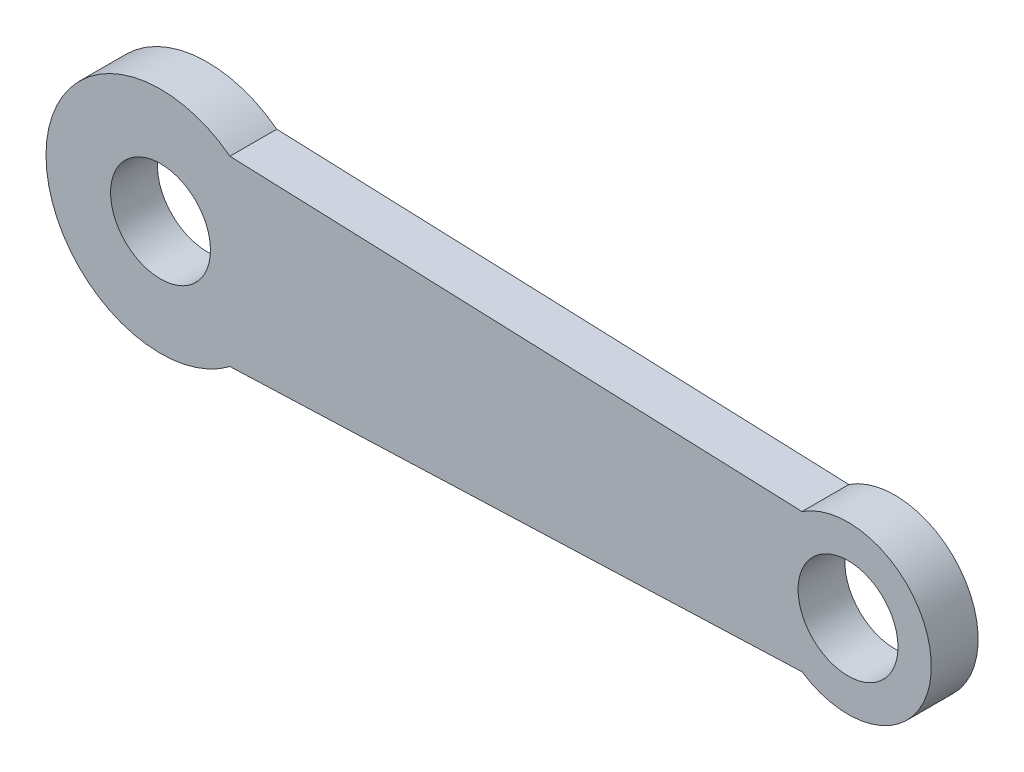
ISO-10303-21;
HEADER;
FILE_DESCRIPTION(('STEP AP214'),'2;1');
FILE_NAME('part.step','',(''),(''),'','','');
FILE_SCHEMA(('AUTOMOTIVE_DESIGN { 1 0 10303 214 1 1 1 1 }'));
ENDSEC;
DATA;
#1=APPLICATION_CONTEXT('core data for automotive mechanical design processes');
#2=APPLICATION_PROTOCOL_DEFINITION('international standard','automotive_design',2000,#1);
#3=PRODUCT_CONTEXT('',#1,'mechanical');
#4=PRODUCT('Part','Part','',(#3));
#5=PRODUCT_RELATED_PRODUCT_CATEGORY('part','',(#4));
#6=PRODUCT_DEFINITION_FORMATION('','',#4);
#7=PRODUCT_DEFINITION_CONTEXT('part definition',#1,'design');
#8=PRODUCT_DEFINITION('design','',#6,#7);
#9=PRODUCT_DEFINITION_SHAPE('','',#8);
#10=(LENGTH_UNIT() NAMED_UNIT(*) SI_UNIT(.MILLI.,.METRE.));
#11=(NAMED_UNIT(*) PLANE_ANGLE_UNIT() SI_UNIT($,.RADIAN.));
#12=(NAMED_UNIT(*) SI_UNIT($,.STERADIAN.) SOLID_ANGLE_UNIT());
#13=UNCERTAINTY_MEASURE_WITH_UNIT(LENGTH_MEASURE(1.E-05),#10,'distance_accuracy_value','');
#14=(GEOMETRIC_REPRESENTATION_CONTEXT(3) GLOBAL_UNCERTAINTY_ASSIGNED_CONTEXT((#13)) GLOBAL_UNIT_ASSIGNED_CONTEXT((#10,
#11,#12)) REPRESENTATION_CONTEXT('',''));
#15=CARTESIAN_POINT('',(0.,0.,0.));
#16=DIRECTION('',(0.,0.,1.));
#17=DIRECTION('',(1.,0.,0.));
#18=AXIS2_PLACEMENT_3D('',#15,#16,#17);
#19=CARTESIAN_POINT('',(0.,-9.,2.25));
#20=DIRECTION('',(-0.0378240593322877,0.999284414236321,0.));
#21=DIRECTION('',(-0.999284414236321,-0.0378240593322877,0.));
#22=AXIS2_PLACEMENT_3D('',#19,#20,#21);
#23=PLANE('',#22);
#24=DIRECTION('',(0.,0.,-1.));
#25=VECTOR('',#24,1.);
#26=CARTESIAN_POINT('',(61.6270569048173,-6.66734532868355,2.25));
#27=LINE('',#26,#25);
#28=CARTESIAN_POINT('',(61.6270569048173,-6.66734532868355,2.25));
#29=VERTEX_POINT('',#28);
#30=CARTESIAN_POINT('',(61.6270569048173,-6.66734532868355,-2.25));
#31=VERTEX_POINT('',#30);
#32=EDGE_CURVE('E58',#29,#31,#27,.T.);
#33=ORIENTED_EDGE('',*,*,#32,.F.);
#34=DIRECTION('',(0.999284414236321,0.0378240593322877,0.));
#35=VECTOR('',#34,1.);
#36=CARTESIAN_POINT('',(0.,-9.,2.25));
#37=LINE('',#36,#35);
#38=CARTESIAN_POINT('',(6.6693507070867,-8.74755743884441,2.25));
#39=VERTEX_POINT('',#38);
#40=EDGE_CURVE('E89',#39,#29,#37,.T.);
#41=ORIENTED_EDGE('',*,*,#40,.F.);
#42=DIRECTION('',(0.,0.,-1.));
#43=VECTOR('',#42,1.);
#44=CARTESIAN_POINT('',(6.6693507070867,-8.74755743884441,2.25));
#45=LINE('',#44,#43);
#46=CARTESIAN_POINT('',(6.6693507070867,-8.74755743884441,-2.25));
#47=VERTEX_POINT('',#46);
#48=EDGE_CURVE('E94',#39,#47,#45,.T.);
#49=ORIENTED_EDGE('',*,*,#48,.T.);
#50=DIRECTION('',(0.999284414236321,0.0378240593322877,0.));
#51=VECTOR('',#50,1.);
#52=CARTESIAN_POINT('',(0.,-9.,-2.25));
#53=LINE('',#52,#51);
#54=EDGE_CURVE('E57',#47,#31,#53,.T.);
#55=ORIENTED_EDGE('',*,*,#54,.T.);
#56=EDGE_LOOP('',(#33,#41,#49,#55));
#57=FACE_BOUND('',#56,.T.);
#58=ADVANCED_FACE('F39',(#57),#23,.F.);
#59=CARTESIAN_POINT('',(66.0482,6.5,2.25));
#60=DIRECTION('',(-0.0378240593322877,-0.999284414236321,0.));
#61=DIRECTION('',(0.999284414236321,-0.0378240593322877,0.));
#62=AXIS2_PLACEMENT_3D('',#59,#60,#61);
#63=PLANE('',#62);
#64=DIRECTION('',(0.,0.,-1.));
#65=VECTOR('',#64,1.);
#66=CARTESIAN_POINT('',(61.6270569048173,6.66734532868355,2.25));
#67=LINE('',#66,#65);
#68=CARTESIAN_POINT('',(61.6270569048173,6.66734532868355,-2.25));
#69=VERTEX_POINT('',#68);
#70=CARTESIAN_POINT('',(61.6270569048173,6.66734532868355,2.25));
#71=VERTEX_POINT('',#70);
#72=EDGE_CURVE('E11',#69,#71,#67,.F.);
#73=ORIENTED_EDGE('',*,*,#72,.F.);
#74=DIRECTION('',(-0.999284414236321,0.0378240593322877,0.));
#75=VECTOR('',#74,1.);
#76=CARTESIAN_POINT('',(66.0482,6.5,-2.25));
#77=LINE('',#76,#75);
#78=CARTESIAN_POINT('',(6.6693507070867,8.74755743884441,-2.25));
#79=VERTEX_POINT('',#78);
#80=EDGE_CURVE('E99',#69,#79,#77,.T.);
#81=ORIENTED_EDGE('',*,*,#80,.T.);
#82=DIRECTION('',(0.,0.,-1.));
#83=VECTOR('',#82,1.);
#84=CARTESIAN_POINT('',(6.6693507070867,8.74755743884441,2.25));
#85=LINE('',#84,#83);
#86=CARTESIAN_POINT('',(6.66935070708669,8.74755743884441,2.25));
#87=VERTEX_POINT('',#86);
#88=EDGE_CURVE('E87',#79,#87,#85,.F.);
#89=ORIENTED_EDGE('',*,*,#88,.T.);
#90=DIRECTION('',(-0.999284414236321,0.0378240593322877,0.));
#91=VECTOR('',#90,1.);
#92=CARTESIAN_POINT('',(66.0482,6.5,2.25));
#93=LINE('',#92,#91);
#94=EDGE_CURVE('E85',#71,#87,#93,.T.);
#95=ORIENTED_EDGE('',*,*,#94,.F.);
#96=EDGE_LOOP('',(#73,#81,#89,#95));
#97=FACE_BOUND('',#96,.T.);
#98=ADVANCED_FACE('F96',(#97),#63,.F.);
#99=CARTESIAN_POINT('',(0.,0.,2.25));
#100=DIRECTION('',(0.,0.,-1.));
#101=DIRECTION('',(-1.,0.,0.));
#102=AXIS2_PLACEMENT_3D('',#99,#100,#101);
#103=CYLINDRICAL_SURFACE('',#102,11.);
#104=ORIENTED_EDGE('',*,*,#48,.F.);
#105=CARTESIAN_POINT('',(0.,0.,2.25));
#106=DIRECTION('',(0.,0.,1.));
#107=DIRECTION('',(1.,0.,0.));
#108=AXIS2_PLACEMENT_3D('',#105,#106,#107);
#109=CIRCLE('',#108,11.);
#110=EDGE_CURVE('E48',#87,#39,#109,.T.);
#111=ORIENTED_EDGE('',*,*,#110,.F.);
#112=ORIENTED_EDGE('',*,*,#88,.F.);
#113=CARTESIAN_POINT('',(0.,0.,-2.25));
#114=DIRECTION('',(0.,0.,1.));
#115=DIRECTION('',(1.,0.,0.));
#116=AXIS2_PLACEMENT_3D('',#113,#114,#115);
#117=CIRCLE('',#116,11.);
#118=EDGE_CURVE('E98',#79,#47,#117,.T.);
#119=ORIENTED_EDGE('',*,*,#118,.T.);
#120=EDGE_LOOP('',(#104,#111,#112,#119));
#121=FACE_BOUND('',#120,.T.);
#122=ADVANCED_FACE('F41',(#121),#103,.T.);
#123=CARTESIAN_POINT('',(0.,0.,2.25));
#124=DIRECTION('',(0.,0.,1.));
#125=DIRECTION('',(1.,0.,0.));
#126=AXIS2_PLACEMENT_3D('',#123,#124,#125);
#127=PLANE('',#126);
#128=CARTESIAN_POINT('',(0.,0.,2.25));
#129=DIRECTION('',(0.,0.,1.));
#130=DIRECTION('',(1.,0.,0.));
#131=AXIS2_PLACEMENT_3D('',#128,#129,#130);
#132=CIRCLE('',#131,4.8);
#133=CARTESIAN_POINT('',(4.8,0.,2.25));
#134=VERTEX_POINT('',#133);
#135=EDGE_CURVE('E116',#134,#134,#132,.T.);
#136=ORIENTED_EDGE('',*,*,#135,.F.);
#137=EDGE_LOOP('',(#136));
#138=FACE_BOUND('',#137,.T.);
#139=CARTESIAN_POINT('',(66.0482,0.,2.25));
#140=DIRECTION('',(0.,0.,1.));
#141=DIRECTION('',(1.,0.,0.));
#142=AXIS2_PLACEMENT_3D('',#139,#140,#141);
#143=CIRCLE('',#142,4.8);
#144=CARTESIAN_POINT('',(70.8482,0.,2.25));
#145=VERTEX_POINT('',#144);
#146=EDGE_CURVE('E108',#145,#145,#143,.T.);
#147=ORIENTED_EDGE('',*,*,#146,.F.);
#148=EDGE_LOOP('',(#147));
#149=FACE_BOUND('',#148,.T.);
#150=CARTESIAN_POINT('',(66.0482,0.,2.25));
#151=DIRECTION('',(0.,0.,1.));
#152=DIRECTION('',(1.,0.,0.));
#153=AXIS2_PLACEMENT_3D('',#150,#151,#152);
#154=CIRCLE('',#153,7.99999999999999);
#155=EDGE_CURVE('E86',#29,#71,#154,.T.);
#156=ORIENTED_EDGE('',*,*,#155,.T.);
#157=ORIENTED_EDGE('',*,*,#94,.T.);
#158=ORIENTED_EDGE('',*,*,#110,.T.);
#159=ORIENTED_EDGE('',*,*,#40,.T.);
#160=EDGE_LOOP('',(#156,#157,#158,#159));
#161=FACE_BOUND('',#160,.T.);
#162=ADVANCED_FACE('F81',(#138,#149,#161),#127,.T.);
#163=CARTESIAN_POINT('',(0.,0.,-2.25));
#164=DIRECTION('',(0.,0.,1.));
#165=DIRECTION('',(1.,0.,0.));
#166=AXIS2_PLACEMENT_3D('',#163,#164,#165);
#167=PLANE('',#166);
#168=CARTESIAN_POINT('',(0.,0.,-2.25));
#169=DIRECTION('',(0.,0.,1.));
#170=DIRECTION('',(1.,0.,0.));
#171=AXIS2_PLACEMENT_3D('',#168,#169,#170);
#172=CIRCLE('',#171,4.8);
#173=CARTESIAN_POINT('',(4.8,0.,-2.25));
#174=VERTEX_POINT('',#173);
#175=EDGE_CURVE('E43',#174,#174,#172,.T.);
#176=ORIENTED_EDGE('',*,*,#175,.T.);
#177=EDGE_LOOP('',(#176));
#178=FACE_BOUND('',#177,.T.);
#179=CARTESIAN_POINT('',(66.0482,0.,-2.25));
#180=DIRECTION('',(0.,0.,1.));
#181=DIRECTION('',(1.,0.,0.));
#182=AXIS2_PLACEMENT_3D('',#179,#180,#181);
#183=CIRCLE('',#182,4.8);
#184=CARTESIAN_POINT('',(70.8482,0.,-2.25));
#185=VERTEX_POINT('',#184);
#186=EDGE_CURVE('E106',#185,#185,#183,.T.);
#187=ORIENTED_EDGE('',*,*,#186,.T.);
#188=EDGE_LOOP('',(#187));
#189=FACE_BOUND('',#188,.T.);
#190=ORIENTED_EDGE('',*,*,#80,.F.);
#191=CARTESIAN_POINT('',(66.0482,0.,-2.25));
#192=DIRECTION('',(0.,0.,1.));
#193=DIRECTION('',(1.,0.,0.));
#194=AXIS2_PLACEMENT_3D('',#191,#192,#193);
#195=CIRCLE('',#194,7.99999999999999);
#196=EDGE_CURVE('E119',#31,#69,#195,.T.);
#197=ORIENTED_EDGE('',*,*,#196,.F.);
#198=ORIENTED_EDGE('',*,*,#54,.F.);
#199=ORIENTED_EDGE('',*,*,#118,.F.);
#200=EDGE_LOOP('',(#190,#197,#198,#199));
#201=FACE_BOUND('',#200,.T.);
#202=ADVANCED_FACE('F126',(#178,#189,#201),#167,.F.);
#203=CARTESIAN_POINT('',(66.0482,0.,2.25));
#204=DIRECTION('',(0.,0.,-1.));
#205=DIRECTION('',(-1.,0.,0.));
#206=AXIS2_PLACEMENT_3D('',#203,#204,#205);
#207=CYLINDRICAL_SURFACE('',#206,7.99999999999999);
#208=ORIENTED_EDGE('',*,*,#155,.F.);
#209=ORIENTED_EDGE('',*,*,#32,.T.);
#210=ORIENTED_EDGE('',*,*,#196,.T.);
#211=ORIENTED_EDGE('',*,*,#72,.T.);
#212=EDGE_LOOP('',(#208,#209,#210,#211));
#213=FACE_BOUND('',#212,.T.);
#214=ADVANCED_FACE('F127',(#213),#207,.T.);
#215=CARTESIAN_POINT('',(66.0482,0.,-4.5));
#216=DIRECTION('',(0.,0.,1.));
#217=DIRECTION('',(1.,0.,0.));
#218=AXIS2_PLACEMENT_3D('',#215,#216,#217);
#219=CYLINDRICAL_SURFACE('',#218,4.8);
#220=ORIENTED_EDGE('',*,*,#146,.T.);
#221=EDGE_LOOP('',(#220));
#222=FACE_BOUND('',#221,.T.);
#223=ORIENTED_EDGE('',*,*,#186,.F.);
#224=EDGE_LOOP('',(#223));
#225=FACE_BOUND('',#224,.T.);
#226=ADVANCED_FACE('F147',(#222,#225),#219,.F.);
#227=CARTESIAN_POINT('',(0.,0.,-4.5));
#228=DIRECTION('',(0.,0.,1.));
#229=DIRECTION('',(1.,0.,0.));
#230=AXIS2_PLACEMENT_3D('',#227,#228,#229);
#231=CYLINDRICAL_SURFACE('',#230,4.8);
#232=ORIENTED_EDGE('',*,*,#135,.T.);
#233=EDGE_LOOP('',(#232));
#234=FACE_BOUND('',#233,.T.);
#235=ORIENTED_EDGE('',*,*,#175,.F.);
#236=EDGE_LOOP('',(#235));
#237=FACE_BOUND('',#236,.T.);
#238=ADVANCED_FACE('F146',(#234,#237),#231,.F.);
#239=CLOSED_SHELL('',(#58,#98,#122,#162,#202,#214,#226,#238));
#240=MANIFOLD_SOLID_BREP('B2',#239);
#241=ADVANCED_BREP_SHAPE_REPRESENTATION('',(#18,#240),#14);
#242=SHAPE_DEFINITION_REPRESENTATION(#9,#241);
ENDSEC;
END-ISO-10303-21;
